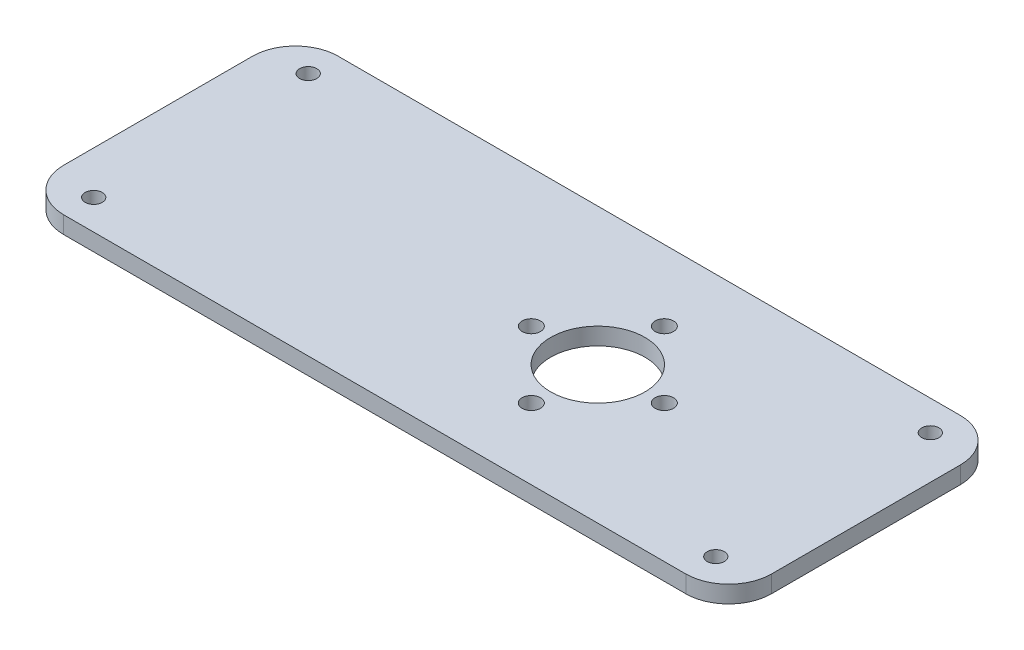
ISO-10303-21;
HEADER;
FILE_DESCRIPTION(('STEP AP214'),'2;1');
FILE_NAME('part.step','',(''),(''),'','','');
FILE_SCHEMA(('AUTOMOTIVE_DESIGN { 1 0 10303 214 1 1 1 1 }'));
ENDSEC;
DATA;
#1=APPLICATION_CONTEXT('core data for automotive mechanical design processes');
#2=APPLICATION_PROTOCOL_DEFINITION('international standard','automotive_design',2000,#1);
#3=PRODUCT_CONTEXT('',#1,'mechanical');
#4=PRODUCT('Part','Part','',(#3));
#5=PRODUCT_RELATED_PRODUCT_CATEGORY('part','',(#4));
#6=PRODUCT_DEFINITION_FORMATION('','',#4);
#7=PRODUCT_DEFINITION_CONTEXT('part definition',#1,'design');
#8=PRODUCT_DEFINITION('design','',#6,#7);
#9=PRODUCT_DEFINITION_SHAPE('','',#8);
#10=(LENGTH_UNIT() NAMED_UNIT(*) SI_UNIT(.MILLI.,.METRE.));
#11=(NAMED_UNIT(*) PLANE_ANGLE_UNIT() SI_UNIT($,.RADIAN.));
#12=(NAMED_UNIT(*) SI_UNIT($,.STERADIAN.) SOLID_ANGLE_UNIT());
#13=UNCERTAINTY_MEASURE_WITH_UNIT(LENGTH_MEASURE(1.E-05),#10,'distance_accuracy_value','');
#14=(GEOMETRIC_REPRESENTATION_CONTEXT(3) GLOBAL_UNCERTAINTY_ASSIGNED_CONTEXT((#13)) GLOBAL_UNIT_ASSIGNED_CONTEXT((#10,
#11,#12)) REPRESENTATION_CONTEXT('',''));
#15=CARTESIAN_POINT('',(0.,0.,0.));
#16=DIRECTION('',(0.,0.,1.));
#17=DIRECTION('',(1.,0.,0.));
#18=AXIS2_PLACEMENT_3D('',#15,#16,#17);
#19=CARTESIAN_POINT('',(0.,4.,0.));
#20=DIRECTION('',(0.,-1.,0.));
#21=DIRECTION('',(0.,0.,-1.));
#22=AXIS2_PLACEMENT_3D('',#19,#20,#21);
#23=PLANE('',#22);
#24=DIRECTION('',(-1.,0.,0.));
#25=VECTOR('',#24,1.);
#26=CARTESIAN_POINT('',(0.,4.,-64.));
#27=LINE('',#26,#25);
#28=CARTESIAN_POINT('',(155.,4.,-64.));
#29=VERTEX_POINT('',#28);
#30=CARTESIAN_POINT('',(10.,4.,-64.));
#31=VERTEX_POINT('',#30);
#32=EDGE_CURVE('E141',#29,#31,#27,.T.);
#33=ORIENTED_EDGE('',*,*,#32,.T.);
#34=CARTESIAN_POINT('',(10.,4.,-54.));
#35=DIRECTION('',(0.,-1.,0.));
#36=DIRECTION('',(0.,0.,-1.));
#37=AXIS2_PLACEMENT_3D('',#34,#35,#36);
#38=CIRCLE('',#37,10.);
#39=CARTESIAN_POINT('',(0.,4.,-54.));
#40=VERTEX_POINT('',#39);
#41=EDGE_CURVE('E160',#31,#40,#38,.F.);
#42=ORIENTED_EDGE('',*,*,#41,.T.);
#43=DIRECTION('',(0.,0.,1.));
#44=VECTOR('',#43,1.);
#45=CARTESIAN_POINT('',(0.,4.,0.));
#46=LINE('',#45,#44);
#47=CARTESIAN_POINT('',(0.,4.,-10.));
#48=VERTEX_POINT('',#47);
#49=EDGE_CURVE('E124',#40,#48,#46,.T.);
#50=ORIENTED_EDGE('',*,*,#49,.T.);
#51=CARTESIAN_POINT('',(10.,4.,-10.));
#52=DIRECTION('',(0.,-1.,0.));
#53=DIRECTION('',(0.,0.,-1.));
#54=AXIS2_PLACEMENT_3D('',#51,#52,#53);
#55=CIRCLE('',#54,10.);
#56=CARTESIAN_POINT('',(10.,4.,0.));
#57=VERTEX_POINT('',#56);
#58=EDGE_CURVE('E158',#48,#57,#55,.F.);
#59=ORIENTED_EDGE('',*,*,#58,.T.);
#60=DIRECTION('',(1.,0.,0.));
#61=VECTOR('',#60,1.);
#62=CARTESIAN_POINT('',(0.,4.,0.));
#63=LINE('',#62,#61);
#64=CARTESIAN_POINT('',(155.,4.,0.));
#65=VERTEX_POINT('',#64);
#66=EDGE_CURVE('E171',#57,#65,#63,.T.);
#67=ORIENTED_EDGE('',*,*,#66,.T.);
#68=CARTESIAN_POINT('',(155.,4.,-10.));
#69=DIRECTION('',(0.,-1.,0.));
#70=DIRECTION('',(0.,0.,-1.));
#71=AXIS2_PLACEMENT_3D('',#68,#69,#70);
#72=CIRCLE('',#71,10.);
#73=CARTESIAN_POINT('',(165.,4.,-10.));
#74=VERTEX_POINT('',#73);
#75=EDGE_CURVE('E59',#65,#74,#72,.F.);
#76=ORIENTED_EDGE('',*,*,#75,.T.);
#77=DIRECTION('',(0.,0.,-1.));
#78=VECTOR('',#77,1.);
#79=CARTESIAN_POINT('',(165.,4.,0.));
#80=LINE('',#79,#78);
#81=CARTESIAN_POINT('',(165.,4.,-54.));
#82=VERTEX_POINT('',#81);
#83=EDGE_CURVE('E179',#74,#82,#80,.T.);
#84=ORIENTED_EDGE('',*,*,#83,.T.);
#85=CARTESIAN_POINT('',(155.,4.,-54.));
#86=DIRECTION('',(0.,-1.,0.));
#87=DIRECTION('',(0.,0.,-1.));
#88=AXIS2_PLACEMENT_3D('',#85,#86,#87);
#89=CIRCLE('',#88,10.);
#90=EDGE_CURVE('E155',#82,#29,#89,.F.);
#91=ORIENTED_EDGE('',*,*,#90,.T.);
#92=EDGE_LOOP('',(#33,#42,#50,#59,#67,#76,#84,#91));
#93=FACE_BOUND('',#92,.T.);
#94=CARTESIAN_POINT('',(10.,4.,-57.));
#95=DIRECTION('',(0.,1.,0.));
#96=DIRECTION('',(0.,0.,1.));
#97=AXIS2_PLACEMENT_3D('',#94,#95,#96);
#98=CIRCLE('',#97,2.);
#99=CARTESIAN_POINT('',(10.,4.,-55.));
#100=VERTEX_POINT('',#99);
#101=EDGE_CURVE('E132',#100,#100,#98,.T.);
#102=ORIENTED_EDGE('',*,*,#101,.F.);
#103=EDGE_LOOP('',(#102));
#104=FACE_BOUND('',#103,.T.);
#105=CARTESIAN_POINT('',(155.,4.,-57.));
#106=DIRECTION('',(0.,1.,0.));
#107=DIRECTION('',(0.,0.,1.));
#108=AXIS2_PLACEMENT_3D('',#105,#106,#107);
#109=CIRCLE('',#108,1.99999999999997);
#110=CARTESIAN_POINT('',(155.,4.,-55.));
#111=VERTEX_POINT('',#110);
#112=EDGE_CURVE('E186',#111,#111,#109,.T.);
#113=ORIENTED_EDGE('',*,*,#112,.F.);
#114=EDGE_LOOP('',(#113));
#115=FACE_BOUND('',#114,.T.);
#116=CARTESIAN_POINT('',(155.,4.,-7.00000000000001));
#117=DIRECTION('',(0.,1.,0.));
#118=DIRECTION('',(0.,0.,1.));
#119=AXIS2_PLACEMENT_3D('',#116,#117,#118);
#120=CIRCLE('',#119,1.99999999999997);
#121=CARTESIAN_POINT('',(155.,4.,-5.00000000000004));
#122=VERTEX_POINT('',#121);
#123=EDGE_CURVE('E191',#122,#122,#120,.T.);
#124=ORIENTED_EDGE('',*,*,#123,.F.);
#125=EDGE_LOOP('',(#124));
#126=FACE_BOUND('',#125,.T.);
#127=CARTESIAN_POINT('',(10.,4.,-6.99999999999999));
#128=DIRECTION('',(0.,1.,0.));
#129=DIRECTION('',(0.,0.,1.));
#130=AXIS2_PLACEMENT_3D('',#127,#128,#129);
#131=CIRCLE('',#130,2.);
#132=CARTESIAN_POINT('',(10.,4.,-4.99999999999999));
#133=VERTEX_POINT('',#132);
#134=EDGE_CURVE('E197',#133,#133,#131,.T.);
#135=ORIENTED_EDGE('',*,*,#134,.F.);
#136=EDGE_LOOP('',(#135));
#137=FACE_BOUND('',#136,.T.);
#138=CARTESIAN_POINT('',(102.5,4.,-47.5));
#139=DIRECTION('',(0.,1.,0.));
#140=DIRECTION('',(0.,0.,1.));
#141=AXIS2_PLACEMENT_3D('',#138,#139,#140);
#142=CIRCLE('',#141,2.15);
#143=CARTESIAN_POINT('',(102.5,4.,-45.35));
#144=VERTEX_POINT('',#143);
#145=EDGE_CURVE('E203',#144,#144,#142,.T.);
#146=ORIENTED_EDGE('',*,*,#145,.F.);
#147=EDGE_LOOP('',(#146));
#148=FACE_BOUND('',#147,.T.);
#149=CARTESIAN_POINT('',(87.,4.,-32.));
#150=DIRECTION('',(0.,1.,0.));
#151=DIRECTION('',(0.,0.,1.));
#152=AXIS2_PLACEMENT_3D('',#149,#150,#151);
#153=CIRCLE('',#152,2.15);
#154=CARTESIAN_POINT('',(87.,4.,-29.85));
#155=VERTEX_POINT('',#154);
#156=EDGE_CURVE('E209',#155,#155,#153,.T.);
#157=ORIENTED_EDGE('',*,*,#156,.F.);
#158=EDGE_LOOP('',(#157));
#159=FACE_BOUND('',#158,.T.);
#160=CARTESIAN_POINT('',(102.5,4.,-16.5));
#161=DIRECTION('',(0.,1.,0.));
#162=DIRECTION('',(0.,0.,1.));
#163=AXIS2_PLACEMENT_3D('',#160,#161,#162);
#164=CIRCLE('',#163,2.15);
#165=CARTESIAN_POINT('',(102.5,4.,-14.35));
#166=VERTEX_POINT('',#165);
#167=EDGE_CURVE('E215',#166,#166,#164,.T.);
#168=ORIENTED_EDGE('',*,*,#167,.F.);
#169=EDGE_LOOP('',(#168));
#170=FACE_BOUND('',#169,.T.);
#171=CARTESIAN_POINT('',(118.,4.,-32.));
#172=DIRECTION('',(0.,1.,0.));
#173=DIRECTION('',(0.,0.,1.));
#174=AXIS2_PLACEMENT_3D('',#171,#172,#173);
#175=CIRCLE('',#174,2.15);
#176=CARTESIAN_POINT('',(118.,4.,-29.85));
#177=VERTEX_POINT('',#176);
#178=EDGE_CURVE('E221',#177,#177,#175,.T.);
#179=ORIENTED_EDGE('',*,*,#178,.F.);
#180=EDGE_LOOP('',(#179));
#181=FACE_BOUND('',#180,.T.);
#182=CARTESIAN_POINT('',(102.5,4.,-32.));
#183=DIRECTION('',(0.,1.,0.));
#184=DIRECTION('',(0.,0.,1.));
#185=AXIS2_PLACEMENT_3D('',#182,#183,#184);
#186=CIRCLE('',#185,11.);
#187=CARTESIAN_POINT('',(102.5,4.,-21.));
#188=VERTEX_POINT('',#187);
#189=EDGE_CURVE('E227',#188,#188,#186,.T.);
#190=ORIENTED_EDGE('',*,*,#189,.F.);
#191=EDGE_LOOP('',(#190));
#192=FACE_BOUND('',#191,.T.);
#193=ADVANCED_FACE('F38',(#93,#104,#115,#126,#137,#148,#159,#170,#181,#192),#23,.F.);
#194=CARTESIAN_POINT('',(0.,0.,0.));
#195=DIRECTION('',(0.,-1.,0.));
#196=DIRECTION('',(0.,0.,-1.));
#197=AXIS2_PLACEMENT_3D('',#194,#195,#196);
#198=PLANE('',#197);
#199=CARTESIAN_POINT('',(118.,0.,-32.));
#200=DIRECTION('',(0.,1.,0.));
#201=DIRECTION('',(0.,0.,1.));
#202=AXIS2_PLACEMENT_3D('',#199,#200,#201);
#203=CIRCLE('',#202,2.15);
#204=CARTESIAN_POINT('',(118.,0.,-29.85));
#205=VERTEX_POINT('',#204);
#206=EDGE_CURVE('E224',#205,#205,#203,.T.);
#207=ORIENTED_EDGE('',*,*,#206,.T.);
#208=EDGE_LOOP('',(#207));
#209=FACE_BOUND('',#208,.T.);
#210=CARTESIAN_POINT('',(87.,0.,-32.));
#211=DIRECTION('',(0.,1.,0.));
#212=DIRECTION('',(0.,0.,1.));
#213=AXIS2_PLACEMENT_3D('',#210,#211,#212);
#214=CIRCLE('',#213,2.15);
#215=CARTESIAN_POINT('',(87.,0.,-29.85));
#216=VERTEX_POINT('',#215);
#217=EDGE_CURVE('E212',#216,#216,#214,.T.);
#218=ORIENTED_EDGE('',*,*,#217,.T.);
#219=EDGE_LOOP('',(#218));
#220=FACE_BOUND('',#219,.T.);
#221=CARTESIAN_POINT('',(10.,0.,-6.99999999999999));
#222=DIRECTION('',(0.,1.,0.));
#223=DIRECTION('',(0.,0.,1.));
#224=AXIS2_PLACEMENT_3D('',#221,#222,#223);
#225=CIRCLE('',#224,2.);
#226=CARTESIAN_POINT('',(10.,0.,-4.99999999999999));
#227=VERTEX_POINT('',#226);
#228=EDGE_CURVE('E200',#227,#227,#225,.T.);
#229=ORIENTED_EDGE('',*,*,#228,.T.);
#230=EDGE_LOOP('',(#229));
#231=FACE_BOUND('',#230,.T.);
#232=CARTESIAN_POINT('',(155.,0.,-57.));
#233=DIRECTION('',(0.,1.,0.));
#234=DIRECTION('',(0.,0.,1.));
#235=AXIS2_PLACEMENT_3D('',#232,#233,#234);
#236=CIRCLE('',#235,1.99999999999997);
#237=CARTESIAN_POINT('',(155.,0.,-55.));
#238=VERTEX_POINT('',#237);
#239=EDGE_CURVE('E188',#238,#238,#236,.T.);
#240=ORIENTED_EDGE('',*,*,#239,.T.);
#241=EDGE_LOOP('',(#240));
#242=FACE_BOUND('',#241,.T.);
#243=DIRECTION('',(0.,0.,1.));
#244=VECTOR('',#243,1.);
#245=CARTESIAN_POINT('',(0.,0.,0.));
#246=LINE('',#245,#244);
#247=CARTESIAN_POINT('',(0.,0.,-54.));
#248=VERTEX_POINT('',#247);
#249=CARTESIAN_POINT('',(0.,0.,-10.));
#250=VERTEX_POINT('',#249);
#251=EDGE_CURVE('E121',#248,#250,#246,.T.);
#252=ORIENTED_EDGE('',*,*,#251,.F.);
#253=CARTESIAN_POINT('',(10.,0.,-54.));
#254=DIRECTION('',(0.,-1.,0.));
#255=DIRECTION('',(0.,0.,-1.));
#256=AXIS2_PLACEMENT_3D('',#253,#254,#255);
#257=CIRCLE('',#256,10.);
#258=CARTESIAN_POINT('',(10.,0.,-64.));
#259=VERTEX_POINT('',#258);
#260=EDGE_CURVE('E104',#248,#259,#257,.T.);
#261=ORIENTED_EDGE('',*,*,#260,.T.);
#262=DIRECTION('',(-1.,0.,0.));
#263=VECTOR('',#262,1.);
#264=CARTESIAN_POINT('',(0.,0.,-64.));
#265=LINE('',#264,#263);
#266=CARTESIAN_POINT('',(155.,0.,-64.));
#267=VERTEX_POINT('',#266);
#268=EDGE_CURVE('E145',#267,#259,#265,.T.);
#269=ORIENTED_EDGE('',*,*,#268,.F.);
#270=CARTESIAN_POINT('',(155.,0.,-54.));
#271=DIRECTION('',(0.,-1.,0.));
#272=DIRECTION('',(0.,0.,-1.));
#273=AXIS2_PLACEMENT_3D('',#270,#271,#272);
#274=CIRCLE('',#273,10.);
#275=CARTESIAN_POINT('',(165.,0.,-54.));
#276=VERTEX_POINT('',#275);
#277=EDGE_CURVE('E125',#267,#276,#274,.T.);
#278=ORIENTED_EDGE('',*,*,#277,.T.);
#279=DIRECTION('',(0.,0.,-1.));
#280=VECTOR('',#279,1.);
#281=CARTESIAN_POINT('',(165.,0.,0.));
#282=LINE('',#281,#280);
#283=CARTESIAN_POINT('',(165.,0.,-10.));
#284=VERTEX_POINT('',#283);
#285=EDGE_CURVE('E135',#284,#276,#282,.T.);
#286=ORIENTED_EDGE('',*,*,#285,.F.);
#287=CARTESIAN_POINT('',(155.,0.,-10.));
#288=DIRECTION('',(0.,-1.,0.));
#289=DIRECTION('',(0.,0.,-1.));
#290=AXIS2_PLACEMENT_3D('',#287,#288,#289);
#291=CIRCLE('',#290,10.);
#292=CARTESIAN_POINT('',(155.,0.,0.));
#293=VERTEX_POINT('',#292);
#294=EDGE_CURVE('E149',#284,#293,#291,.T.);
#295=ORIENTED_EDGE('',*,*,#294,.T.);
#296=DIRECTION('',(1.,0.,0.));
#297=VECTOR('',#296,1.);
#298=CARTESIAN_POINT('',(0.,0.,0.));
#299=LINE('',#298,#297);
#300=CARTESIAN_POINT('',(10.,0.,0.));
#301=VERTEX_POINT('',#300);
#302=EDGE_CURVE('E131',#301,#293,#299,.T.);
#303=ORIENTED_EDGE('',*,*,#302,.F.);
#304=CARTESIAN_POINT('',(10.,0.,-10.));
#305=DIRECTION('',(0.,-1.,0.));
#306=DIRECTION('',(0.,0.,-1.));
#307=AXIS2_PLACEMENT_3D('',#304,#305,#306);
#308=CIRCLE('',#307,10.);
#309=EDGE_CURVE('E115',#301,#250,#308,.T.);
#310=ORIENTED_EDGE('',*,*,#309,.T.);
#311=EDGE_LOOP('',(#252,#261,#269,#278,#286,#295,#303,#310));
#312=FACE_BOUND('',#311,.T.);
#313=CARTESIAN_POINT('',(10.,0.,-57.));
#314=DIRECTION('',(0.,1.,0.));
#315=DIRECTION('',(0.,0.,1.));
#316=AXIS2_PLACEMENT_3D('',#313,#314,#315);
#317=CIRCLE('',#316,2.);
#318=CARTESIAN_POINT('',(10.,0.,-55.));
#319=VERTEX_POINT('',#318);
#320=EDGE_CURVE('E138',#319,#319,#317,.T.);
#321=ORIENTED_EDGE('',*,*,#320,.T.);
#322=EDGE_LOOP('',(#321));
#323=FACE_BOUND('',#322,.T.);
#324=CARTESIAN_POINT('',(155.,0.,-7.00000000000001));
#325=DIRECTION('',(0.,1.,0.));
#326=DIRECTION('',(0.,0.,1.));
#327=AXIS2_PLACEMENT_3D('',#324,#325,#326);
#328=CIRCLE('',#327,1.99999999999997);
#329=CARTESIAN_POINT('',(155.,0.,-5.00000000000004));
#330=VERTEX_POINT('',#329);
#331=EDGE_CURVE('E194',#330,#330,#328,.T.);
#332=ORIENTED_EDGE('',*,*,#331,.T.);
#333=EDGE_LOOP('',(#332));
#334=FACE_BOUND('',#333,.T.);
#335=CARTESIAN_POINT('',(102.5,0.,-47.5));
#336=DIRECTION('',(0.,1.,0.));
#337=DIRECTION('',(0.,0.,1.));
#338=AXIS2_PLACEMENT_3D('',#335,#336,#337);
#339=CIRCLE('',#338,2.15);
#340=CARTESIAN_POINT('',(102.5,0.,-45.35));
#341=VERTEX_POINT('',#340);
#342=EDGE_CURVE('E206',#341,#341,#339,.T.);
#343=ORIENTED_EDGE('',*,*,#342,.T.);
#344=EDGE_LOOP('',(#343));
#345=FACE_BOUND('',#344,.T.);
#346=CARTESIAN_POINT('',(102.5,0.,-16.5));
#347=DIRECTION('',(0.,1.,0.));
#348=DIRECTION('',(0.,0.,1.));
#349=AXIS2_PLACEMENT_3D('',#346,#347,#348);
#350=CIRCLE('',#349,2.15);
#351=CARTESIAN_POINT('',(102.5,0.,-14.35));
#352=VERTEX_POINT('',#351);
#353=EDGE_CURVE('E218',#352,#352,#350,.T.);
#354=ORIENTED_EDGE('',*,*,#353,.T.);
#355=EDGE_LOOP('',(#354));
#356=FACE_BOUND('',#355,.T.);
#357=CARTESIAN_POINT('',(102.5,0.,-32.));
#358=DIRECTION('',(0.,1.,0.));
#359=DIRECTION('',(0.,0.,1.));
#360=AXIS2_PLACEMENT_3D('',#357,#358,#359);
#361=CIRCLE('',#360,11.);
#362=CARTESIAN_POINT('',(102.5,0.,-21.));
#363=VERTEX_POINT('',#362);
#364=EDGE_CURVE('E230',#363,#363,#361,.T.);
#365=ORIENTED_EDGE('',*,*,#364,.T.);
#366=EDGE_LOOP('',(#365));
#367=FACE_BOUND('',#366,.T.);
#368=ADVANCED_FACE('F128',(#209,#220,#231,#242,#312,#323,#334,#345,#356,#367),#198,.T.);
#369=CARTESIAN_POINT('',(0.,4.,0.));
#370=DIRECTION('',(1.,0.,0.));
#371=DIRECTION('',(0.,0.,-1.));
#372=AXIS2_PLACEMENT_3D('',#369,#370,#371);
#373=PLANE('',#372);
#374=ORIENTED_EDGE('',*,*,#49,.F.);
#375=DIRECTION('',(0.,-1.,0.));
#376=VECTOR('',#375,1.);
#377=CARTESIAN_POINT('',(0.,4.,-54.));
#378=LINE('',#377,#376);
#379=EDGE_CURVE('E108',#40,#248,#378,.T.);
#380=ORIENTED_EDGE('',*,*,#379,.T.);
#381=ORIENTED_EDGE('',*,*,#251,.T.);
#382=DIRECTION('',(0.,-1.,0.));
#383=VECTOR('',#382,1.);
#384=CARTESIAN_POINT('',(0.,4.,-10.));
#385=LINE('',#384,#383);
#386=EDGE_CURVE('E126',#250,#48,#385,.F.);
#387=ORIENTED_EDGE('',*,*,#386,.T.);
#388=EDGE_LOOP('',(#374,#380,#381,#387));
#389=FACE_BOUND('',#388,.T.);
#390=ADVANCED_FACE('F120',(#389),#373,.F.);
#391=CARTESIAN_POINT('',(0.,4.,0.));
#392=DIRECTION('',(0.,0.,-1.));
#393=DIRECTION('',(-1.,0.,0.));
#394=AXIS2_PLACEMENT_3D('',#391,#392,#393);
#395=PLANE('',#394);
#396=ORIENTED_EDGE('',*,*,#66,.F.);
#397=DIRECTION('',(0.,-1.,0.));
#398=VECTOR('',#397,1.);
#399=CARTESIAN_POINT('',(10.,4.,0.));
#400=LINE('',#399,#398);
#401=EDGE_CURVE('E164',#57,#301,#400,.T.);
#402=ORIENTED_EDGE('',*,*,#401,.T.);
#403=ORIENTED_EDGE('',*,*,#302,.T.);
#404=DIRECTION('',(0.,-1.,0.));
#405=VECTOR('',#404,1.);
#406=CARTESIAN_POINT('',(155.,4.,0.));
#407=LINE('',#406,#405);
#408=EDGE_CURVE('E162',#293,#65,#407,.F.);
#409=ORIENTED_EDGE('',*,*,#408,.T.);
#410=EDGE_LOOP('',(#396,#402,#403,#409));
#411=FACE_BOUND('',#410,.T.);
#412=ADVANCED_FACE('F169',(#411),#395,.F.);
#413=CARTESIAN_POINT('',(165.,4.,0.));
#414=DIRECTION('',(-1.,0.,0.));
#415=DIRECTION('',(0.,0.,1.));
#416=AXIS2_PLACEMENT_3D('',#413,#414,#415);
#417=PLANE('',#416);
#418=ORIENTED_EDGE('',*,*,#83,.F.);
#419=DIRECTION('',(0.,-1.,0.));
#420=VECTOR('',#419,1.);
#421=CARTESIAN_POINT('',(165.,4.,-10.));
#422=LINE('',#421,#420);
#423=EDGE_CURVE('E11',#74,#284,#422,.T.);
#424=ORIENTED_EDGE('',*,*,#423,.T.);
#425=ORIENTED_EDGE('',*,*,#285,.T.);
#426=DIRECTION('',(0.,-1.,0.));
#427=VECTOR('',#426,1.);
#428=CARTESIAN_POINT('',(165.,4.,-54.));
#429=LINE('',#428,#427);
#430=EDGE_CURVE('E46',#276,#82,#429,.F.);
#431=ORIENTED_EDGE('',*,*,#430,.T.);
#432=EDGE_LOOP('',(#418,#424,#425,#431));
#433=FACE_BOUND('',#432,.T.);
#434=ADVANCED_FACE('F178',(#433),#417,.F.);
#435=CARTESIAN_POINT('',(0.,4.,-64.));
#436=DIRECTION('',(0.,0.,1.));
#437=DIRECTION('',(1.,0.,0.));
#438=AXIS2_PLACEMENT_3D('',#435,#436,#437);
#439=PLANE('',#438);
#440=ORIENTED_EDGE('',*,*,#268,.T.);
#441=DIRECTION('',(0.,-1.,0.));
#442=VECTOR('',#441,1.);
#443=CARTESIAN_POINT('',(10.,4.,-64.));
#444=LINE('',#443,#442);
#445=EDGE_CURVE('E109',#259,#31,#444,.F.);
#446=ORIENTED_EDGE('',*,*,#445,.T.);
#447=ORIENTED_EDGE('',*,*,#32,.F.);
#448=DIRECTION('',(0.,-1.,0.));
#449=VECTOR('',#448,1.);
#450=CARTESIAN_POINT('',(155.,4.,-64.));
#451=LINE('',#450,#449);
#452=EDGE_CURVE('E114',#29,#267,#451,.T.);
#453=ORIENTED_EDGE('',*,*,#452,.T.);
#454=EDGE_LOOP('',(#440,#446,#447,#453));
#455=FACE_BOUND('',#454,.T.);
#456=ADVANCED_FACE('F252',(#455),#439,.F.);
#457=CARTESIAN_POINT('',(10.,4.,-57.));
#458=DIRECTION('',(0.,-1.,0.));
#459=DIRECTION('',(0.,0.,-1.));
#460=AXIS2_PLACEMENT_3D('',#457,#458,#459);
#461=CYLINDRICAL_SURFACE('',#460,2.);
#462=ORIENTED_EDGE('',*,*,#101,.T.);
#463=EDGE_LOOP('',(#462));
#464=FACE_BOUND('',#463,.T.);
#465=ORIENTED_EDGE('',*,*,#320,.F.);
#466=EDGE_LOOP('',(#465));
#467=FACE_BOUND('',#466,.T.);
#468=ADVANCED_FACE('F249',(#464,#467),#461,.F.);
#469=CARTESIAN_POINT('',(155.,4.,-57.));
#470=DIRECTION('',(0.,-1.,0.));
#471=DIRECTION('',(0.,0.,-1.));
#472=AXIS2_PLACEMENT_3D('',#469,#470,#471);
#473=CYLINDRICAL_SURFACE('',#472,1.99999999999997);
#474=ORIENTED_EDGE('',*,*,#112,.T.);
#475=EDGE_LOOP('',(#474));
#476=FACE_BOUND('',#475,.T.);
#477=ORIENTED_EDGE('',*,*,#239,.F.);
#478=EDGE_LOOP('',(#477));
#479=FACE_BOUND('',#478,.T.);
#480=ADVANCED_FACE('F337',(#476,#479),#473,.F.);
#481=CARTESIAN_POINT('',(155.,4.,-7.00000000000001));
#482=DIRECTION('',(0.,-1.,0.));
#483=DIRECTION('',(0.,0.,-1.));
#484=AXIS2_PLACEMENT_3D('',#481,#482,#483);
#485=CYLINDRICAL_SURFACE('',#484,1.99999999999997);
#486=ORIENTED_EDGE('',*,*,#123,.T.);
#487=EDGE_LOOP('',(#486));
#488=FACE_BOUND('',#487,.T.);
#489=ORIENTED_EDGE('',*,*,#331,.F.);
#490=EDGE_LOOP('',(#489));
#491=FACE_BOUND('',#490,.T.);
#492=ADVANCED_FACE('F345',(#488,#491),#485,.F.);
#493=CARTESIAN_POINT('',(10.,4.,-6.99999999999999));
#494=DIRECTION('',(0.,-1.,0.));
#495=DIRECTION('',(0.,0.,-1.));
#496=AXIS2_PLACEMENT_3D('',#493,#494,#495);
#497=CYLINDRICAL_SURFACE('',#496,2.);
#498=ORIENTED_EDGE('',*,*,#134,.T.);
#499=EDGE_LOOP('',(#498));
#500=FACE_BOUND('',#499,.T.);
#501=ORIENTED_EDGE('',*,*,#228,.F.);
#502=EDGE_LOOP('',(#501));
#503=FACE_BOUND('',#502,.T.);
#504=ADVANCED_FACE('F353',(#500,#503),#497,.F.);
#505=CARTESIAN_POINT('',(102.5,4.,-47.5));
#506=DIRECTION('',(0.,-1.,0.));
#507=DIRECTION('',(0.,0.,-1.));
#508=AXIS2_PLACEMENT_3D('',#505,#506,#507);
#509=CYLINDRICAL_SURFACE('',#508,2.15);
#510=ORIENTED_EDGE('',*,*,#145,.T.);
#511=EDGE_LOOP('',(#510));
#512=FACE_BOUND('',#511,.T.);
#513=ORIENTED_EDGE('',*,*,#342,.F.);
#514=EDGE_LOOP('',(#513));
#515=FACE_BOUND('',#514,.T.);
#516=ADVANCED_FACE('F362',(#512,#515),#509,.F.);
#517=CARTESIAN_POINT('',(87.,4.,-32.));
#518=DIRECTION('',(0.,-1.,0.));
#519=DIRECTION('',(0.,0.,-1.));
#520=AXIS2_PLACEMENT_3D('',#517,#518,#519);
#521=CYLINDRICAL_SURFACE('',#520,2.15);
#522=ORIENTED_EDGE('',*,*,#156,.T.);
#523=EDGE_LOOP('',(#522));
#524=FACE_BOUND('',#523,.T.);
#525=ORIENTED_EDGE('',*,*,#217,.F.);
#526=EDGE_LOOP('',(#525));
#527=FACE_BOUND('',#526,.T.);
#528=ADVANCED_FACE('F371',(#524,#527),#521,.F.);
#529=CARTESIAN_POINT('',(102.5,4.,-16.5));
#530=DIRECTION('',(0.,-1.,0.));
#531=DIRECTION('',(0.,0.,-1.));
#532=AXIS2_PLACEMENT_3D('',#529,#530,#531);
#533=CYLINDRICAL_SURFACE('',#532,2.15);
#534=ORIENTED_EDGE('',*,*,#167,.T.);
#535=EDGE_LOOP('',(#534));
#536=FACE_BOUND('',#535,.T.);
#537=ORIENTED_EDGE('',*,*,#353,.F.);
#538=EDGE_LOOP('',(#537));
#539=FACE_BOUND('',#538,.T.);
#540=ADVANCED_FACE('F380',(#536,#539),#533,.F.);
#541=CARTESIAN_POINT('',(118.,4.,-32.));
#542=DIRECTION('',(0.,-1.,0.));
#543=DIRECTION('',(0.,0.,-1.));
#544=AXIS2_PLACEMENT_3D('',#541,#542,#543);
#545=CYLINDRICAL_SURFACE('',#544,2.15);
#546=ORIENTED_EDGE('',*,*,#178,.T.);
#547=EDGE_LOOP('',(#546));
#548=FACE_BOUND('',#547,.T.);
#549=ORIENTED_EDGE('',*,*,#206,.F.);
#550=EDGE_LOOP('',(#549));
#551=FACE_BOUND('',#550,.T.);
#552=ADVANCED_FACE('F389',(#548,#551),#545,.F.);
#553=CARTESIAN_POINT('',(102.5,4.,-32.));
#554=DIRECTION('',(0.,-1.,0.));
#555=DIRECTION('',(0.,0.,-1.));
#556=AXIS2_PLACEMENT_3D('',#553,#554,#555);
#557=CYLINDRICAL_SURFACE('',#556,11.);
#558=ORIENTED_EDGE('',*,*,#189,.T.);
#559=EDGE_LOOP('',(#558));
#560=FACE_BOUND('',#559,.T.);
#561=ORIENTED_EDGE('',*,*,#364,.F.);
#562=EDGE_LOOP('',(#561));
#563=FACE_BOUND('',#562,.T.);
#564=ADVANCED_FACE('F236',(#560,#563),#557,.F.);
#565=CARTESIAN_POINT('',(10.,4.,-54.));
#566=DIRECTION('',(0.,-1.,0.));
#567=DIRECTION('',(0.,0.,-1.));
#568=AXIS2_PLACEMENT_3D('',#565,#566,#567);
#569=CYLINDRICAL_SURFACE('',#568,10.);
#570=ORIENTED_EDGE('',*,*,#41,.F.);
#571=ORIENTED_EDGE('',*,*,#445,.F.);
#572=ORIENTED_EDGE('',*,*,#260,.F.);
#573=ORIENTED_EDGE('',*,*,#379,.F.);
#574=EDGE_LOOP('',(#570,#571,#572,#573));
#575=FACE_BOUND('',#574,.T.);
#576=ADVANCED_FACE('F107',(#575),#569,.T.);
#577=CARTESIAN_POINT('',(10.,4.,-10.));
#578=DIRECTION('',(0.,-1.,0.));
#579=DIRECTION('',(0.,0.,-1.));
#580=AXIS2_PLACEMENT_3D('',#577,#578,#579);
#581=CYLINDRICAL_SURFACE('',#580,10.);
#582=ORIENTED_EDGE('',*,*,#58,.F.);
#583=ORIENTED_EDGE('',*,*,#386,.F.);
#584=ORIENTED_EDGE('',*,*,#309,.F.);
#585=ORIENTED_EDGE('',*,*,#401,.F.);
#586=EDGE_LOOP('',(#582,#583,#584,#585));
#587=FACE_BOUND('',#586,.T.);
#588=ADVANCED_FACE('F264',(#587),#581,.T.);
#589=CARTESIAN_POINT('',(155.,4.,-10.));
#590=DIRECTION('',(0.,-1.,0.));
#591=DIRECTION('',(0.,0.,-1.));
#592=AXIS2_PLACEMENT_3D('',#589,#590,#591);
#593=CYLINDRICAL_SURFACE('',#592,10.);
#594=ORIENTED_EDGE('',*,*,#75,.F.);
#595=ORIENTED_EDGE('',*,*,#408,.F.);
#596=ORIENTED_EDGE('',*,*,#294,.F.);
#597=ORIENTED_EDGE('',*,*,#423,.F.);
#598=EDGE_LOOP('',(#594,#595,#596,#597));
#599=FACE_BOUND('',#598,.T.);
#600=ADVANCED_FACE('F177',(#599),#593,.T.);
#601=CARTESIAN_POINT('',(155.,4.,-54.));
#602=DIRECTION('',(0.,-1.,0.));
#603=DIRECTION('',(0.,0.,-1.));
#604=AXIS2_PLACEMENT_3D('',#601,#602,#603);
#605=CYLINDRICAL_SURFACE('',#604,10.);
#606=ORIENTED_EDGE('',*,*,#90,.F.);
#607=ORIENTED_EDGE('',*,*,#430,.F.);
#608=ORIENTED_EDGE('',*,*,#277,.F.);
#609=ORIENTED_EDGE('',*,*,#452,.F.);
#610=EDGE_LOOP('',(#606,#607,#608,#609));
#611=FACE_BOUND('',#610,.T.);
#612=ADVANCED_FACE('F40',(#611),#605,.T.);
#613=CLOSED_SHELL('',(#193,#368,#390,#412,#434,#456,#468,#480,#492,#504,#516,#528,#540,#552,
#564,#576,#588,#600,#612));
#614=MANIFOLD_SOLID_BREP('B2',#613);
#615=ADVANCED_BREP_SHAPE_REPRESENTATION('',(#18,#614),#14);
#616=SHAPE_DEFINITION_REPRESENTATION(#9,#615);
ENDSEC;
END-ISO-10303-21;
